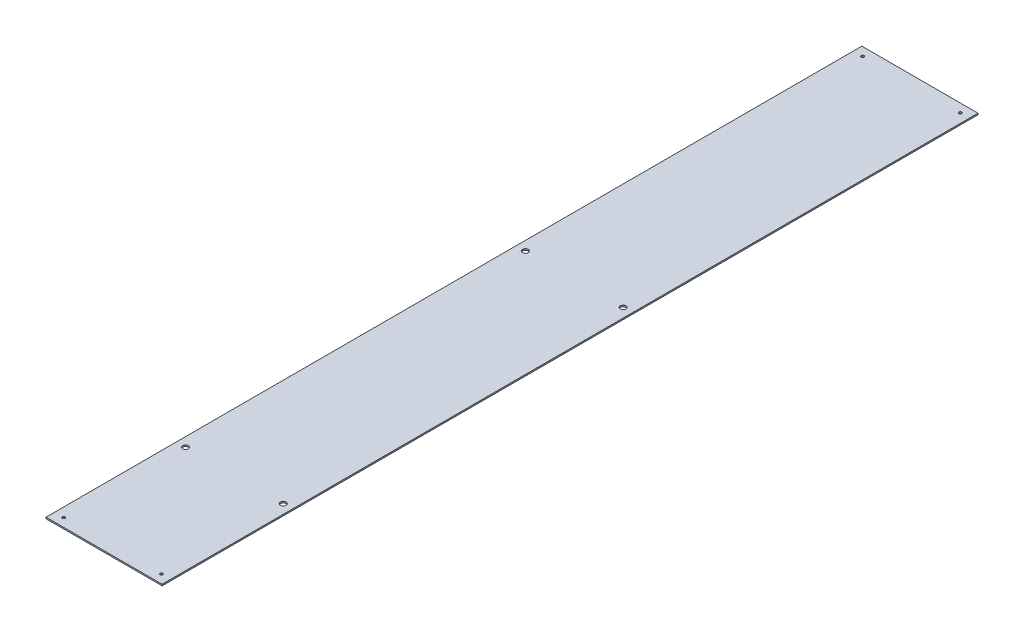
ISO-10303-21;
HEADER;
FILE_DESCRIPTION(('STEP AP214'),'2;1');
FILE_NAME('part.step','',(''),(''),'','','');
FILE_SCHEMA(('AUTOMOTIVE_DESIGN { 1 0 10303 214 1 1 1 1 }'));
ENDSEC;
DATA;
#1=APPLICATION_CONTEXT('core data for automotive mechanical design processes');
#2=APPLICATION_PROTOCOL_DEFINITION('international standard','automotive_design',2000,#1);
#3=PRODUCT_CONTEXT('',#1,'mechanical');
#4=PRODUCT('Part','Part','',(#3));
#5=PRODUCT_RELATED_PRODUCT_CATEGORY('part','',(#4));
#6=PRODUCT_DEFINITION_FORMATION('','',#4);
#7=PRODUCT_DEFINITION_CONTEXT('part definition',#1,'design');
#8=PRODUCT_DEFINITION('design','',#6,#7);
#9=PRODUCT_DEFINITION_SHAPE('','',#8);
#10=(LENGTH_UNIT() NAMED_UNIT(*) SI_UNIT(.MILLI.,.METRE.));
#11=(NAMED_UNIT(*) PLANE_ANGLE_UNIT() SI_UNIT($,.RADIAN.));
#12=(NAMED_UNIT(*) SI_UNIT($,.STERADIAN.) SOLID_ANGLE_UNIT());
#13=UNCERTAINTY_MEASURE_WITH_UNIT(LENGTH_MEASURE(1.E-05),#10,'distance_accuracy_value','');
#14=(GEOMETRIC_REPRESENTATION_CONTEXT(3) GLOBAL_UNCERTAINTY_ASSIGNED_CONTEXT((#13)) GLOBAL_UNIT_ASSIGNED_CONTEXT((#10,
#11,#12)) REPRESENTATION_CONTEXT('',''));
#15=CARTESIAN_POINT('',(0.,0.,0.));
#16=DIRECTION('',(0.,0.,1.));
#17=DIRECTION('',(1.,0.,0.));
#18=AXIS2_PLACEMENT_3D('',#15,#16,#17);
#19=CARTESIAN_POINT('',(65.0875,-1.5875,457.2));
#20=DIRECTION('',(1.,0.,0.));
#21=DIRECTION('',(0.,0.,-1.));
#22=AXIS2_PLACEMENT_3D('',#19,#20,#21);
#23=PLANE('',#22);
#24=DIRECTION('',(0.,0.,-1.));
#25=VECTOR('',#24,1.);
#26=CARTESIAN_POINT('',(65.0875,0.,457.2));
#27=LINE('',#26,#25);
#28=CARTESIAN_POINT('',(65.0875,0.,457.2));
#29=VERTEX_POINT('',#28);
#30=CARTESIAN_POINT('',(65.0875,0.,-457.2));
#31=VERTEX_POINT('',#30);
#32=EDGE_CURVE('E100',#29,#31,#27,.T.);
#33=ORIENTED_EDGE('',*,*,#32,.F.);
#34=DIRECTION('',(0.,1.,0.));
#35=VECTOR('',#34,1.);
#36=CARTESIAN_POINT('',(65.0875,-1.5875,457.2));
#37=LINE('',#36,#35);
#38=CARTESIAN_POINT('',(65.0875,-1.5875,457.2));
#39=VERTEX_POINT('',#38);
#40=EDGE_CURVE('E11',#39,#29,#37,.T.);
#41=ORIENTED_EDGE('',*,*,#40,.F.);
#42=DIRECTION('',(0.,0.,-1.));
#43=VECTOR('',#42,1.);
#44=CARTESIAN_POINT('',(65.0875,-1.5875,457.2));
#45=LINE('',#44,#43);
#46=CARTESIAN_POINT('',(65.0875,-1.5875,-457.2));
#47=VERTEX_POINT('',#46);
#48=EDGE_CURVE('E93',#39,#47,#45,.T.);
#49=ORIENTED_EDGE('',*,*,#48,.T.);
#50=DIRECTION('',(0.,1.,0.));
#51=VECTOR('',#50,1.);
#52=CARTESIAN_POINT('',(65.0875,-1.5875,-457.2));
#53=LINE('',#52,#51);
#54=EDGE_CURVE('E38',#47,#31,#53,.T.);
#55=ORIENTED_EDGE('',*,*,#54,.T.);
#56=EDGE_LOOP('',(#33,#41,#49,#55));
#57=FACE_BOUND('',#56,.T.);
#58=ADVANCED_FACE('F35',(#57),#23,.T.);
#59=CARTESIAN_POINT('',(-65.0875,-1.5875,457.2));
#60=DIRECTION('',(0.,0.,1.));
#61=DIRECTION('',(1.,0.,0.));
#62=AXIS2_PLACEMENT_3D('',#59,#60,#61);
#63=PLANE('',#62);
#64=DIRECTION('',(1.,0.,0.));
#65=VECTOR('',#64,1.);
#66=CARTESIAN_POINT('',(-65.0875,0.,457.2));
#67=LINE('',#66,#65);
#68=CARTESIAN_POINT('',(-65.0875,0.,457.2));
#69=VERTEX_POINT('',#68);
#70=EDGE_CURVE('E95',#69,#29,#67,.T.);
#71=ORIENTED_EDGE('',*,*,#70,.F.);
#72=DIRECTION('',(0.,1.,0.));
#73=VECTOR('',#72,1.);
#74=CARTESIAN_POINT('',(-65.0875,-1.5875,457.2));
#75=LINE('',#74,#73);
#76=CARTESIAN_POINT('',(-65.0875,-1.5875,457.2));
#77=VERTEX_POINT('',#76);
#78=EDGE_CURVE('E44',#77,#69,#75,.T.);
#79=ORIENTED_EDGE('',*,*,#78,.F.);
#80=DIRECTION('',(1.,0.,0.));
#81=VECTOR('',#80,1.);
#82=CARTESIAN_POINT('',(-65.0875,-1.5875,457.2));
#83=LINE('',#82,#81);
#84=EDGE_CURVE('E90',#77,#39,#83,.T.);
#85=ORIENTED_EDGE('',*,*,#84,.T.);
#86=ORIENTED_EDGE('',*,*,#40,.T.);
#87=EDGE_LOOP('',(#71,#79,#85,#86));
#88=FACE_BOUND('',#87,.T.);
#89=ADVANCED_FACE('F111',(#88),#63,.T.);
#90=CARTESIAN_POINT('',(-65.0875,-1.5875,457.2));
#91=DIRECTION('',(-1.,0.,0.));
#92=DIRECTION('',(0.,0.,1.));
#93=AXIS2_PLACEMENT_3D('',#90,#91,#92);
#94=PLANE('',#93);
#95=DIRECTION('',(0.,0.,1.));
#96=VECTOR('',#95,1.);
#97=CARTESIAN_POINT('',(-65.0875,0.,457.2));
#98=LINE('',#97,#96);
#99=CARTESIAN_POINT('',(-65.0875,0.,-457.2));
#100=VERTEX_POINT('',#99);
#101=EDGE_CURVE('E85',#100,#69,#98,.T.);
#102=ORIENTED_EDGE('',*,*,#101,.F.);
#103=DIRECTION('',(0.,1.,0.));
#104=VECTOR('',#103,1.);
#105=CARTESIAN_POINT('',(-65.0875,-1.5875,-457.2));
#106=LINE('',#105,#104);
#107=CARTESIAN_POINT('',(-65.0875,-1.5875,-457.2));
#108=VERTEX_POINT('',#107);
#109=EDGE_CURVE('E80',#108,#100,#106,.T.);
#110=ORIENTED_EDGE('',*,*,#109,.F.);
#111=DIRECTION('',(0.,0.,1.));
#112=VECTOR('',#111,1.);
#113=CARTESIAN_POINT('',(-65.0875,-1.5875,457.2));
#114=LINE('',#113,#112);
#115=EDGE_CURVE('E83',#108,#77,#114,.T.);
#116=ORIENTED_EDGE('',*,*,#115,.T.);
#117=ORIENTED_EDGE('',*,*,#78,.T.);
#118=EDGE_LOOP('',(#102,#110,#116,#117));
#119=FACE_BOUND('',#118,.T.);
#120=ADVANCED_FACE('F82',(#119),#94,.T.);
#121=CARTESIAN_POINT('',(-65.0875,-1.5875,-457.2));
#122=DIRECTION('',(0.,0.,-1.));
#123=DIRECTION('',(-1.,0.,0.));
#124=AXIS2_PLACEMENT_3D('',#121,#122,#123);
#125=PLANE('',#124);
#126=DIRECTION('',(-1.,0.,0.));
#127=VECTOR('',#126,1.);
#128=CARTESIAN_POINT('',(-65.0875,0.,-457.2));
#129=LINE('',#128,#127);
#130=EDGE_CURVE('E103',#31,#100,#129,.T.);
#131=ORIENTED_EDGE('',*,*,#130,.F.);
#132=ORIENTED_EDGE('',*,*,#54,.F.);
#133=DIRECTION('',(-1.,0.,0.));
#134=VECTOR('',#133,1.);
#135=CARTESIAN_POINT('',(-65.0875,-1.5875,-457.2));
#136=LINE('',#135,#134);
#137=EDGE_CURVE('E89',#47,#108,#136,.T.);
#138=ORIENTED_EDGE('',*,*,#137,.T.);
#139=ORIENTED_EDGE('',*,*,#109,.T.);
#140=EDGE_LOOP('',(#131,#132,#138,#139));
#141=FACE_BOUND('',#140,.T.);
#142=ADVANCED_FACE('F92',(#141),#125,.T.);
#143=CARTESIAN_POINT('',(0.,-1.5875,0.));
#144=DIRECTION('',(0.,-1.,0.));
#145=DIRECTION('',(0.,0.,-1.));
#146=AXIS2_PLACEMENT_3D('',#143,#144,#145);
#147=PLANE('',#146);
#148=CARTESIAN_POINT('',(-54.76875,-1.5875,447.675));
#149=DIRECTION('',(0.,-1.,0.));
#150=DIRECTION('',(0.,0.,1.));
#151=AXIS2_PLACEMENT_3D('',#148,#149,#150);
#152=CIRCLE('',#151,1.58749999999999);
#153=CARTESIAN_POINT('',(-54.76875,-1.5875,449.2625));
#154=VERTEX_POINT('',#153);
#155=EDGE_CURVE('E168',#154,#154,#152,.T.);
#156=ORIENTED_EDGE('',*,*,#155,.F.);
#157=EDGE_LOOP('',(#156));
#158=FACE_BOUND('',#157,.T.);
#159=CARTESIAN_POINT('',(-54.76875,-1.5875,-69.85));
#160=DIRECTION('',(0.,-1.,0.));
#161=DIRECTION('',(0.,0.,1.));
#162=AXIS2_PLACEMENT_3D('',#159,#160,#161);
#163=CIRCLE('',#162,3.175);
#164=CARTESIAN_POINT('',(-54.76875,-1.5875,-66.675));
#165=VERTEX_POINT('',#164);
#166=EDGE_CURVE('E180',#165,#165,#163,.T.);
#167=ORIENTED_EDGE('',*,*,#166,.F.);
#168=EDGE_LOOP('',(#167));
#169=FACE_BOUND('',#168,.T.);
#170=CARTESIAN_POINT('',(-54.76875,-1.5875,-447.675));
#171=DIRECTION('',(0.,-1.,0.));
#172=DIRECTION('',(0.,0.,1.));
#173=AXIS2_PLACEMENT_3D('',#170,#171,#172);
#174=CIRCLE('',#173,1.5875);
#175=CARTESIAN_POINT('',(-54.76875,-1.5875,-446.0875));
#176=VERTEX_POINT('',#175);
#177=EDGE_CURVE('E189',#176,#176,#174,.T.);
#178=ORIENTED_EDGE('',*,*,#177,.F.);
#179=EDGE_LOOP('',(#178));
#180=FACE_BOUND('',#179,.T.);
#181=CARTESIAN_POINT('',(-54.76875,-1.5875,311.15));
#182=DIRECTION('',(0.,-1.,0.));
#183=DIRECTION('',(0.,0.,1.));
#184=AXIS2_PLACEMENT_3D('',#181,#182,#183);
#185=CIRCLE('',#184,3.175);
#186=CARTESIAN_POINT('',(-54.76875,-1.5875,314.325));
#187=VERTEX_POINT('',#186);
#188=EDGE_CURVE('E172',#187,#187,#185,.T.);
#189=ORIENTED_EDGE('',*,*,#188,.F.);
#190=EDGE_LOOP('',(#189));
#191=FACE_BOUND('',#190,.T.);
#192=CARTESIAN_POINT('',(54.76875,-1.5875,447.675));
#193=DIRECTION('',(0.,1.,0.));
#194=DIRECTION('',(0.,0.,1.));
#195=AXIS2_PLACEMENT_3D('',#192,#193,#194);
#196=CIRCLE('',#195,1.58749999999999);
#197=CARTESIAN_POINT('',(54.76875,-1.5875,449.2625));
#198=VERTEX_POINT('',#197);
#199=EDGE_CURVE('E104',#198,#198,#196,.T.);
#200=ORIENTED_EDGE('',*,*,#199,.T.);
#201=EDGE_LOOP('',(#200));
#202=FACE_BOUND('',#201,.T.);
#203=CARTESIAN_POINT('',(54.76875,-1.5875,-69.85));
#204=DIRECTION('',(0.,1.,0.));
#205=DIRECTION('',(0.,0.,1.));
#206=AXIS2_PLACEMENT_3D('',#203,#204,#205);
#207=CIRCLE('',#206,3.175);
#208=CARTESIAN_POINT('',(54.76875,-1.5875,-66.675));
#209=VERTEX_POINT('',#208);
#210=EDGE_CURVE('E200',#209,#209,#207,.T.);
#211=ORIENTED_EDGE('',*,*,#210,.T.);
#212=EDGE_LOOP('',(#211));
#213=FACE_BOUND('',#212,.T.);
#214=CARTESIAN_POINT('',(54.76875,-1.5875,-447.675));
#215=DIRECTION('',(0.,1.,0.));
#216=DIRECTION('',(0.,0.,1.));
#217=AXIS2_PLACEMENT_3D('',#214,#215,#216);
#218=CIRCLE('',#217,1.5875);
#219=CARTESIAN_POINT('',(54.76875,-1.5875,-446.0875));
#220=VERTEX_POINT('',#219);
#221=EDGE_CURVE('E211',#220,#220,#218,.T.);
#222=ORIENTED_EDGE('',*,*,#221,.T.);
#223=EDGE_LOOP('',(#222));
#224=FACE_BOUND('',#223,.T.);
#225=CARTESIAN_POINT('',(54.76875,-1.5875,311.15));
#226=DIRECTION('',(0.,1.,0.));
#227=DIRECTION('',(0.,0.,1.));
#228=AXIS2_PLACEMENT_3D('',#225,#226,#227);
#229=CIRCLE('',#228,3.175);
#230=CARTESIAN_POINT('',(54.76875,-1.5875,314.325));
#231=VERTEX_POINT('',#230);
#232=EDGE_CURVE('E199',#231,#231,#229,.T.);
#233=ORIENTED_EDGE('',*,*,#232,.T.);
#234=EDGE_LOOP('',(#233));
#235=FACE_BOUND('',#234,.T.);
#236=ORIENTED_EDGE('',*,*,#48,.F.);
#237=ORIENTED_EDGE('',*,*,#84,.F.);
#238=ORIENTED_EDGE('',*,*,#115,.F.);
#239=ORIENTED_EDGE('',*,*,#137,.F.);
#240=EDGE_LOOP('',(#236,#237,#238,#239));
#241=FACE_BOUND('',#240,.T.);
#242=ADVANCED_FACE('F88',(#158,#169,#180,#191,#202,#213,#224,#235,#241),#147,.T.);
#243=CARTESIAN_POINT('',(0.,0.,0.));
#244=DIRECTION('',(0.,-1.,0.));
#245=DIRECTION('',(0.,0.,-1.));
#246=AXIS2_PLACEMENT_3D('',#243,#244,#245);
#247=PLANE('',#246);
#248=CARTESIAN_POINT('',(-54.76875,0.,447.675));
#249=DIRECTION('',(0.,-1.,0.));
#250=DIRECTION('',(0.,0.,1.));
#251=AXIS2_PLACEMENT_3D('',#248,#249,#250);
#252=CIRCLE('',#251,1.58749999999999);
#253=CARTESIAN_POINT('',(-54.76875,0.,449.2625));
#254=VERTEX_POINT('',#253);
#255=EDGE_CURVE('E171',#254,#254,#252,.T.);
#256=ORIENTED_EDGE('',*,*,#255,.T.);
#257=EDGE_LOOP('',(#256));
#258=FACE_BOUND('',#257,.T.);
#259=CARTESIAN_POINT('',(-54.76875,0.,-69.85));
#260=DIRECTION('',(0.,-1.,0.));
#261=DIRECTION('',(0.,0.,1.));
#262=AXIS2_PLACEMENT_3D('',#259,#260,#261);
#263=CIRCLE('',#262,3.175);
#264=CARTESIAN_POINT('',(-54.76875,0.,-66.675));
#265=VERTEX_POINT('',#264);
#266=EDGE_CURVE('E184',#265,#265,#263,.T.);
#267=ORIENTED_EDGE('',*,*,#266,.T.);
#268=EDGE_LOOP('',(#267));
#269=FACE_BOUND('',#268,.T.);
#270=CARTESIAN_POINT('',(-54.76875,0.,-447.675));
#271=DIRECTION('',(0.,-1.,0.));
#272=DIRECTION('',(0.,0.,1.));
#273=AXIS2_PLACEMENT_3D('',#270,#271,#272);
#274=CIRCLE('',#273,1.5875);
#275=CARTESIAN_POINT('',(-54.76875,0.,-446.0875));
#276=VERTEX_POINT('',#275);
#277=EDGE_CURVE('E183',#276,#276,#274,.T.);
#278=ORIENTED_EDGE('',*,*,#277,.T.);
#279=EDGE_LOOP('',(#278));
#280=FACE_BOUND('',#279,.T.);
#281=CARTESIAN_POINT('',(-54.76875,0.,311.15));
#282=DIRECTION('',(0.,-1.,0.));
#283=DIRECTION('',(0.,0.,1.));
#284=AXIS2_PLACEMENT_3D('',#281,#282,#283);
#285=CIRCLE('',#284,3.175);
#286=CARTESIAN_POINT('',(-54.76875,0.,314.325));
#287=VERTEX_POINT('',#286);
#288=EDGE_CURVE('E177',#287,#287,#285,.T.);
#289=ORIENTED_EDGE('',*,*,#288,.T.);
#290=EDGE_LOOP('',(#289));
#291=FACE_BOUND('',#290,.T.);
#292=CARTESIAN_POINT('',(54.76875,0.,447.675));
#293=DIRECTION('',(0.,1.,0.));
#294=DIRECTION('',(0.,0.,1.));
#295=AXIS2_PLACEMENT_3D('',#292,#293,#294);
#296=CIRCLE('',#295,1.58749999999999);
#297=CARTESIAN_POINT('',(54.76875,0.,449.2625));
#298=VERTEX_POINT('',#297);
#299=EDGE_CURVE('E196',#298,#298,#296,.T.);
#300=ORIENTED_EDGE('',*,*,#299,.F.);
#301=EDGE_LOOP('',(#300));
#302=FACE_BOUND('',#301,.T.);
#303=CARTESIAN_POINT('',(54.76875,0.,-69.85));
#304=DIRECTION('',(0.,1.,0.));
#305=DIRECTION('',(0.,0.,1.));
#306=AXIS2_PLACEMENT_3D('',#303,#304,#305);
#307=CIRCLE('',#306,3.175);
#308=CARTESIAN_POINT('',(54.76875,0.,-66.675));
#309=VERTEX_POINT('',#308);
#310=EDGE_CURVE('E174',#309,#309,#307,.T.);
#311=ORIENTED_EDGE('',*,*,#310,.F.);
#312=EDGE_LOOP('',(#311));
#313=FACE_BOUND('',#312,.T.);
#314=CARTESIAN_POINT('',(54.76875,0.,-447.675));
#315=DIRECTION('',(0.,1.,0.));
#316=DIRECTION('',(0.,0.,1.));
#317=AXIS2_PLACEMENT_3D('',#314,#315,#316);
#318=CIRCLE('',#317,1.5875);
#319=CARTESIAN_POINT('',(54.76875,0.,-446.0875));
#320=VERTEX_POINT('',#319);
#321=EDGE_CURVE('E203',#320,#320,#318,.T.);
#322=ORIENTED_EDGE('',*,*,#321,.F.);
#323=EDGE_LOOP('',(#322));
#324=FACE_BOUND('',#323,.T.);
#325=CARTESIAN_POINT('',(54.76875,0.,311.15));
#326=DIRECTION('',(0.,1.,0.));
#327=DIRECTION('',(0.,0.,1.));
#328=AXIS2_PLACEMENT_3D('',#325,#326,#327);
#329=CIRCLE('',#328,3.175);
#330=CARTESIAN_POINT('',(54.76875,0.,314.325));
#331=VERTEX_POINT('',#330);
#332=EDGE_CURVE('E208',#331,#331,#329,.T.);
#333=ORIENTED_EDGE('',*,*,#332,.F.);
#334=EDGE_LOOP('',(#333));
#335=FACE_BOUND('',#334,.T.);
#336=ORIENTED_EDGE('',*,*,#32,.T.);
#337=ORIENTED_EDGE('',*,*,#130,.T.);
#338=ORIENTED_EDGE('',*,*,#101,.T.);
#339=ORIENTED_EDGE('',*,*,#70,.T.);
#340=EDGE_LOOP('',(#336,#337,#338,#339));
#341=FACE_BOUND('',#340,.T.);
#342=ADVANCED_FACE('F110',(#258,#269,#280,#291,#302,#313,#324,#335,#341),#247,.F.);
#343=CARTESIAN_POINT('',(54.76875,-1.5875,311.15));
#344=DIRECTION('',(0.,1.,0.));
#345=DIRECTION('',(0.,0.,1.));
#346=AXIS2_PLACEMENT_3D('',#343,#344,#345);
#347=CYLINDRICAL_SURFACE('',#346,3.175);
#348=ORIENTED_EDGE('',*,*,#232,.F.);
#349=EDGE_LOOP('',(#348));
#350=FACE_BOUND('',#349,.T.);
#351=ORIENTED_EDGE('',*,*,#332,.T.);
#352=EDGE_LOOP('',(#351));
#353=FACE_BOUND('',#352,.T.);
#354=ADVANCED_FACE('F129',(#350,#353),#347,.F.);
#355=CARTESIAN_POINT('',(54.76875,-1.5875,-447.675));
#356=DIRECTION('',(0.,1.,0.));
#357=DIRECTION('',(0.,0.,1.));
#358=AXIS2_PLACEMENT_3D('',#355,#356,#357);
#359=CYLINDRICAL_SURFACE('',#358,1.5875);
#360=ORIENTED_EDGE('',*,*,#221,.F.);
#361=EDGE_LOOP('',(#360));
#362=FACE_BOUND('',#361,.T.);
#363=ORIENTED_EDGE('',*,*,#321,.T.);
#364=EDGE_LOOP('',(#363));
#365=FACE_BOUND('',#364,.T.);
#366=ADVANCED_FACE('F134',(#362,#365),#359,.F.);
#367=CARTESIAN_POINT('',(54.76875,-1.5875,-69.85));
#368=DIRECTION('',(0.,1.,0.));
#369=DIRECTION('',(0.,0.,1.));
#370=AXIS2_PLACEMENT_3D('',#367,#368,#369);
#371=CYLINDRICAL_SURFACE('',#370,3.175);
#372=ORIENTED_EDGE('',*,*,#210,.F.);
#373=EDGE_LOOP('',(#372));
#374=FACE_BOUND('',#373,.T.);
#375=ORIENTED_EDGE('',*,*,#310,.T.);
#376=EDGE_LOOP('',(#375));
#377=FACE_BOUND('',#376,.T.);
#378=ADVANCED_FACE('F137',(#374,#377),#371,.F.);
#379=CARTESIAN_POINT('',(54.76875,-1.5875,447.675));
#380=DIRECTION('',(0.,1.,0.));
#381=DIRECTION('',(0.,0.,1.));
#382=AXIS2_PLACEMENT_3D('',#379,#380,#381);
#383=CYLINDRICAL_SURFACE('',#382,1.58749999999999);
#384=ORIENTED_EDGE('',*,*,#199,.F.);
#385=EDGE_LOOP('',(#384));
#386=FACE_BOUND('',#385,.T.);
#387=ORIENTED_EDGE('',*,*,#299,.T.);
#388=EDGE_LOOP('',(#387));
#389=FACE_BOUND('',#388,.T.);
#390=ADVANCED_FACE('F144',(#386,#389),#383,.F.);
#391=CARTESIAN_POINT('',(-54.76875,-1.5875,311.15));
#392=DIRECTION('',(0.,1.,0.));
#393=DIRECTION('',(0.,0.,1.));
#394=AXIS2_PLACEMENT_3D('',#391,#392,#393);
#395=CYLINDRICAL_SURFACE('',#394,3.175);
#396=ORIENTED_EDGE('',*,*,#188,.T.);
#397=EDGE_LOOP('',(#396));
#398=FACE_BOUND('',#397,.T.);
#399=ORIENTED_EDGE('',*,*,#288,.F.);
#400=EDGE_LOOP('',(#399));
#401=FACE_BOUND('',#400,.T.);
#402=ADVANCED_FACE('F148',(#398,#401),#395,.F.);
#403=CARTESIAN_POINT('',(-54.76875,-1.5875,-447.675));
#404=DIRECTION('',(0.,1.,0.));
#405=DIRECTION('',(0.,0.,1.));
#406=AXIS2_PLACEMENT_3D('',#403,#404,#405);
#407=CYLINDRICAL_SURFACE('',#406,1.5875);
#408=ORIENTED_EDGE('',*,*,#177,.T.);
#409=EDGE_LOOP('',(#408));
#410=FACE_BOUND('',#409,.T.);
#411=ORIENTED_EDGE('',*,*,#277,.F.);
#412=EDGE_LOOP('',(#411));
#413=FACE_BOUND('',#412,.T.);
#414=ADVANCED_FACE('F150',(#410,#413),#407,.F.);
#415=CARTESIAN_POINT('',(-54.76875,-1.5875,-69.85));
#416=DIRECTION('',(0.,1.,0.));
#417=DIRECTION('',(0.,0.,1.));
#418=AXIS2_PLACEMENT_3D('',#415,#416,#417);
#419=CYLINDRICAL_SURFACE('',#418,3.175);
#420=ORIENTED_EDGE('',*,*,#166,.T.);
#421=EDGE_LOOP('',(#420));
#422=FACE_BOUND('',#421,.T.);
#423=ORIENTED_EDGE('',*,*,#266,.F.);
#424=EDGE_LOOP('',(#423));
#425=FACE_BOUND('',#424,.T.);
#426=ADVANCED_FACE('F153',(#422,#425),#419,.F.);
#427=CARTESIAN_POINT('',(-54.76875,-1.5875,447.675));
#428=DIRECTION('',(0.,1.,0.));
#429=DIRECTION('',(0.,0.,1.));
#430=AXIS2_PLACEMENT_3D('',#427,#428,#429);
#431=CYLINDRICAL_SURFACE('',#430,1.58749999999999);
#432=ORIENTED_EDGE('',*,*,#155,.T.);
#433=EDGE_LOOP('',(#432));
#434=FACE_BOUND('',#433,.T.);
#435=ORIENTED_EDGE('',*,*,#255,.F.);
#436=EDGE_LOOP('',(#435));
#437=FACE_BOUND('',#436,.T.);
#438=ADVANCED_FACE('F160',(#434,#437),#431,.F.);
#439=CLOSED_SHELL('',(#58,#89,#120,#142,#242,#342,#354,#366,#378,#390,#402,#414,#426,#438));
#440=MANIFOLD_SOLID_BREP('B2',#439);
#441=ADVANCED_BREP_SHAPE_REPRESENTATION('',(#18,#440),#14);
#442=SHAPE_DEFINITION_REPRESENTATION(#9,#441);
ENDSEC;
END-ISO-10303-21;
